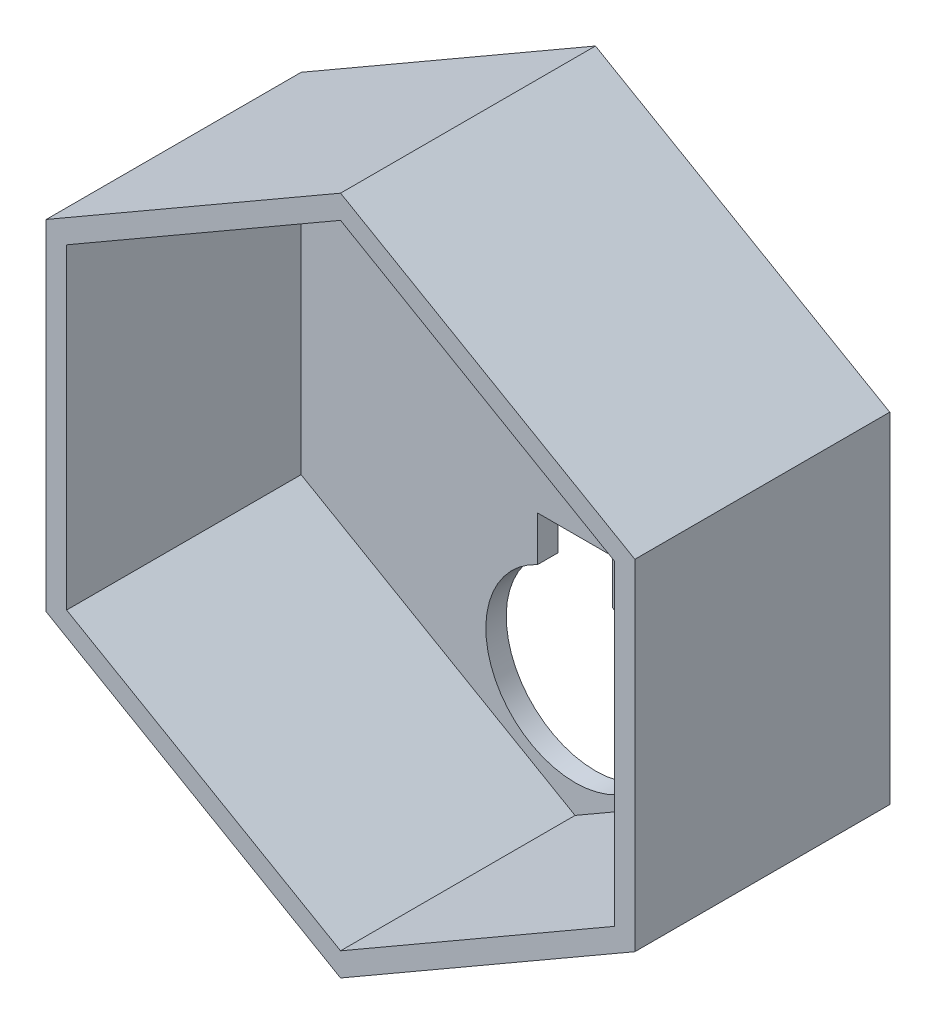
ISO-10303-21;
HEADER;
FILE_DESCRIPTION(('STEP AP214'),'2;1');
FILE_NAME('part.step','',(''),(''),'','','');
FILE_SCHEMA(('AUTOMOTIVE_DESIGN { 1 0 10303 214 1 1 1 1 }'));
ENDSEC;
DATA;
#1=APPLICATION_CONTEXT('core data for automotive mechanical design processes');
#2=APPLICATION_PROTOCOL_DEFINITION('international standard','automotive_design',2000,#1);
#3=PRODUCT_CONTEXT('',#1,'mechanical');
#4=PRODUCT('Part','Part','',(#3));
#5=PRODUCT_RELATED_PRODUCT_CATEGORY('part','',(#4));
#6=PRODUCT_DEFINITION_FORMATION('','',#4);
#7=PRODUCT_DEFINITION_CONTEXT('part definition',#1,'design');
#8=PRODUCT_DEFINITION('design','',#6,#7);
#9=PRODUCT_DEFINITION_SHAPE('','',#8);
#10=(LENGTH_UNIT() NAMED_UNIT(*) SI_UNIT(.MILLI.,.METRE.));
#11=(NAMED_UNIT(*) PLANE_ANGLE_UNIT() SI_UNIT($,.RADIAN.));
#12=(NAMED_UNIT(*) SI_UNIT($,.STERADIAN.) SOLID_ANGLE_UNIT());
#13=UNCERTAINTY_MEASURE_WITH_UNIT(LENGTH_MEASURE(1.E-05),#10,'distance_accuracy_value','');
#14=(GEOMETRIC_REPRESENTATION_CONTEXT(3) GLOBAL_UNCERTAINTY_ASSIGNED_CONTEXT((#13)) GLOBAL_UNIT_ASSIGNED_CONTEXT((#10,
#11,#12)) REPRESENTATION_CONTEXT('',''));
#15=CARTESIAN_POINT('',(0.,0.,0.));
#16=DIRECTION('',(0.,0.,1.));
#17=DIRECTION('',(1.,0.,0.));
#18=AXIS2_PLACEMENT_3D('',#15,#16,#17);
#19=CARTESIAN_POINT('',(0.,0.,15.));
#20=DIRECTION('',(0.,0.,1.));
#21=DIRECTION('',(1.,0.,0.));
#22=AXIS2_PLACEMENT_3D('',#19,#20,#21);
#23=PLANE('',#22);
#24=DIRECTION('',(0.866025403784439,-0.5,0.));
#25=VECTOR('',#24,1.);
#26=CARTESIAN_POINT('',(-17.3205080756888,-9.99999999999999,15.));
#27=LINE('',#26,#25);
#28=CARTESIAN_POINT('',(-17.3205080756888,-9.99999999999999,15.));
#29=VERTEX_POINT('',#28);
#30=CARTESIAN_POINT('',(0.,-20.,15.));
#31=VERTEX_POINT('',#30);
#32=EDGE_CURVE('E259',#29,#31,#27,.T.);
#33=ORIENTED_EDGE('',*,*,#32,.T.);
#34=DIRECTION('',(0.866025403784439,0.5,0.));
#35=VECTOR('',#34,1.);
#36=CARTESIAN_POINT('',(0.,-20.,15.));
#37=LINE('',#36,#35);
#38=CARTESIAN_POINT('',(17.3205080756888,-10.,15.));
#39=VERTEX_POINT('',#38);
#40=EDGE_CURVE('E262',#31,#39,#37,.T.);
#41=ORIENTED_EDGE('',*,*,#40,.T.);
#42=DIRECTION('',(0.,1.,0.));
#43=VECTOR('',#42,1.);
#44=CARTESIAN_POINT('',(17.3205080756888,-10.,15.));
#45=LINE('',#44,#43);
#46=CARTESIAN_POINT('',(17.3205080756888,10.,15.));
#47=VERTEX_POINT('',#46);
#48=EDGE_CURVE('E265',#39,#47,#45,.T.);
#49=ORIENTED_EDGE('',*,*,#48,.T.);
#50=DIRECTION('',(-0.866025403784439,0.5,0.));
#51=VECTOR('',#50,1.);
#52=CARTESIAN_POINT('',(17.3205080756888,10.,15.));
#53=LINE('',#52,#51);
#54=CARTESIAN_POINT('',(0.,20.,15.));
#55=VERTEX_POINT('',#54);
#56=EDGE_CURVE('E267',#47,#55,#53,.T.);
#57=ORIENTED_EDGE('',*,*,#56,.T.);
#58=DIRECTION('',(-0.866025403784439,-0.5,0.));
#59=VECTOR('',#58,1.);
#60=CARTESIAN_POINT('',(0.,20.,15.));
#61=LINE('',#60,#59);
#62=CARTESIAN_POINT('',(-17.3205080756888,10.,15.));
#63=VERTEX_POINT('',#62);
#64=EDGE_CURVE('E269',#55,#63,#61,.T.);
#65=ORIENTED_EDGE('',*,*,#64,.T.);
#66=DIRECTION('',(0.,-1.,0.));
#67=VECTOR('',#66,1.);
#68=CARTESIAN_POINT('',(-17.3205080756888,10.,15.));
#69=LINE('',#68,#67);
#70=EDGE_CURVE('E271',#63,#29,#69,.T.);
#71=ORIENTED_EDGE('',*,*,#70,.T.);
#72=EDGE_LOOP('',(#33,#41,#49,#57,#65,#71));
#73=FACE_BOUND('',#72,.T.);
#74=DIRECTION('',(0.866025403784439,0.5,0.));
#75=VECTOR('',#74,1.);
#76=CARTESIAN_POINT('',(-0.599999999999997,-18.9607695154587,15.));
#77=LINE('',#76,#75);
#78=CARTESIAN_POINT('',(0.,-18.6143593539449,15.));
#79=VERTEX_POINT('',#78);
#80=CARTESIAN_POINT('',(16.1205080756888,-9.30717967697245,15.));
#81=VERTEX_POINT('',#80);
#82=EDGE_CURVE('E232',#79,#81,#77,.T.);
#83=ORIENTED_EDGE('',*,*,#82,.F.);
#84=DIRECTION('',(0.866025403784439,-0.5,0.));
#85=VECTOR('',#84,1.);
#86=CARTESIAN_POINT('',(-16.7205080756888,-8.96076951545867,15.));
#87=LINE('',#86,#85);
#88=CARTESIAN_POINT('',(-16.1205080756888,-9.30717967697244,15.));
#89=VERTEX_POINT('',#88);
#90=EDGE_CURVE('E230',#89,#79,#87,.T.);
#91=ORIENTED_EDGE('',*,*,#90,.F.);
#92=DIRECTION('',(0.,-1.,0.));
#93=VECTOR('',#92,1.);
#94=CARTESIAN_POINT('',(-16.1205080756888,10.,15.));
#95=LINE('',#94,#93);
#96=CARTESIAN_POINT('',(-16.1205080756888,9.30717967697245,15.));
#97=VERTEX_POINT('',#96);
#98=EDGE_CURVE('E241',#97,#89,#95,.T.);
#99=ORIENTED_EDGE('',*,*,#98,.F.);
#100=DIRECTION('',(-0.866025403784439,-0.5,0.));
#101=VECTOR('',#100,1.);
#102=CARTESIAN_POINT('',(0.599999999999993,18.9607695154587,15.));
#103=LINE('',#102,#101);
#104=CARTESIAN_POINT('',(0.,18.6143593539449,15.));
#105=VERTEX_POINT('',#104);
#106=EDGE_CURVE('E238',#105,#97,#103,.T.);
#107=ORIENTED_EDGE('',*,*,#106,.F.);
#108=DIRECTION('',(-0.866025403784439,0.5,0.));
#109=VECTOR('',#108,1.);
#110=CARTESIAN_POINT('',(16.7205080756888,8.96076951545868,15.));
#111=LINE('',#110,#109);
#112=CARTESIAN_POINT('',(16.1205080756888,9.30717967697245,15.));
#113=VERTEX_POINT('',#112);
#114=EDGE_CURVE('E236',#113,#105,#111,.T.);
#115=ORIENTED_EDGE('',*,*,#114,.F.);
#116=DIRECTION('',(0.,1.,0.));
#117=VECTOR('',#116,1.);
#118=CARTESIAN_POINT('',(16.1205080756888,-10.,15.));
#119=LINE('',#118,#117);
#120=EDGE_CURVE('E234',#81,#113,#119,.T.);
#121=ORIENTED_EDGE('',*,*,#120,.F.);
#122=EDGE_LOOP('',(#83,#91,#99,#107,#115,#121));
#123=FACE_BOUND('',#122,.T.);
#124=ADVANCED_FACE('F69',(#73,#123),#23,.T.);
#125=CARTESIAN_POINT('',(0.,0.,0.));
#126=DIRECTION('',(0.,0.,1.));
#127=DIRECTION('',(1.,0.,0.));
#128=AXIS2_PLACEMENT_3D('',#125,#126,#127);
#129=PLANE('',#128);
#130=DIRECTION('',(-1.,0.,0.));
#131=VECTOR('',#130,1.);
#132=CARTESIAN_POINT('',(-2.2,-4.3,0.));
#133=LINE('',#132,#131);
#134=CARTESIAN_POINT('',(2.2,-4.3,0.));
#135=VERTEX_POINT('',#134);
#136=CARTESIAN_POINT('',(-2.2,-4.3,0.));
#137=VERTEX_POINT('',#136);
#138=EDGE_CURVE('E191',#135,#137,#133,.T.);
#139=ORIENTED_EDGE('',*,*,#138,.T.);
#140=DIRECTION('',(0.,-1.,0.));
#141=VECTOR('',#140,1.);
#142=CARTESIAN_POINT('',(-2.2,-4.3,0.));
#143=LINE('',#142,#141);
#144=CARTESIAN_POINT('',(-2.2,-6.92853284530911,0.));
#145=VERTEX_POINT('',#144);
#146=EDGE_CURVE('E204',#137,#145,#143,.T.);
#147=ORIENTED_EDGE('',*,*,#146,.T.);
#148=CARTESIAN_POINT('',(0.,-11.6953451973951,0.));
#149=DIRECTION('',(0.,0.,1.));
#150=DIRECTION('',(1.,0.,0.));
#151=AXIS2_PLACEMENT_3D('',#148,#149,#150);
#152=CIRCLE('',#151,5.25);
#153=CARTESIAN_POINT('',(2.2,-6.92853284530911,0.));
#154=VERTEX_POINT('',#153);
#155=EDGE_CURVE('E203',#145,#154,#152,.T.);
#156=ORIENTED_EDGE('',*,*,#155,.T.);
#157=DIRECTION('',(0.,1.,0.));
#158=VECTOR('',#157,1.);
#159=CARTESIAN_POINT('',(2.2,-4.3,0.));
#160=LINE('',#159,#158);
#161=EDGE_CURVE('E84',#154,#135,#160,.T.);
#162=ORIENTED_EDGE('',*,*,#161,.T.);
#163=EDGE_LOOP('',(#139,#147,#156,#162));
#164=FACE_BOUND('',#163,.T.);
#165=DIRECTION('',(0.866025403784439,-0.5,0.));
#166=VECTOR('',#165,1.);
#167=CARTESIAN_POINT('',(-17.3205080756888,-9.99999999999999,0.));
#168=LINE('',#167,#166);
#169=CARTESIAN_POINT('',(-17.3205080756888,-9.99999999999999,0.));
#170=VERTEX_POINT('',#169);
#171=CARTESIAN_POINT('',(0.,-20.,0.));
#172=VERTEX_POINT('',#171);
#173=EDGE_CURVE('E258',#170,#172,#168,.T.);
#174=ORIENTED_EDGE('',*,*,#173,.F.);
#175=DIRECTION('',(0.,-1.,0.));
#176=VECTOR('',#175,1.);
#177=CARTESIAN_POINT('',(-17.3205080756888,10.,0.));
#178=LINE('',#177,#176);
#179=CARTESIAN_POINT('',(-17.3205080756888,10.,0.));
#180=VERTEX_POINT('',#179);
#181=EDGE_CURVE('E263',#180,#170,#178,.T.);
#182=ORIENTED_EDGE('',*,*,#181,.F.);
#183=DIRECTION('',(-0.866025403784439,-0.5,0.));
#184=VECTOR('',#183,1.);
#185=CARTESIAN_POINT('',(0.,20.,0.));
#186=LINE('',#185,#184);
#187=CARTESIAN_POINT('',(0.,20.,0.));
#188=VERTEX_POINT('',#187);
#189=EDGE_CURVE('E282',#188,#180,#186,.T.);
#190=ORIENTED_EDGE('',*,*,#189,.F.);
#191=DIRECTION('',(-0.866025403784439,0.5,0.));
#192=VECTOR('',#191,1.);
#193=CARTESIAN_POINT('',(17.3205080756888,10.,0.));
#194=LINE('',#193,#192);
#195=CARTESIAN_POINT('',(17.3205080756888,10.,0.));
#196=VERTEX_POINT('',#195);
#197=EDGE_CURVE('E280',#196,#188,#194,.T.);
#198=ORIENTED_EDGE('',*,*,#197,.F.);
#199=DIRECTION('',(0.,1.,0.));
#200=VECTOR('',#199,1.);
#201=CARTESIAN_POINT('',(17.3205080756888,-10.,0.));
#202=LINE('',#201,#200);
#203=CARTESIAN_POINT('',(17.3205080756888,-10.,0.));
#204=VERTEX_POINT('',#203);
#205=EDGE_CURVE('E278',#204,#196,#202,.T.);
#206=ORIENTED_EDGE('',*,*,#205,.F.);
#207=DIRECTION('',(0.866025403784439,0.5,0.));
#208=VECTOR('',#207,1.);
#209=CARTESIAN_POINT('',(0.,-20.,0.));
#210=LINE('',#209,#208);
#211=EDGE_CURVE('E276',#172,#204,#210,.T.);
#212=ORIENTED_EDGE('',*,*,#211,.F.);
#213=EDGE_LOOP('',(#174,#182,#190,#198,#206,#212));
#214=FACE_BOUND('',#213,.T.);
#215=ADVANCED_FACE('F200',(#164,#214),#129,.F.);
#216=CARTESIAN_POINT('',(-17.3205080756888,-9.99999999999999,15.));
#217=DIRECTION('',(0.5,0.866025403784439,0.));
#218=DIRECTION('',(-0.866025403784439,0.5,0.));
#219=AXIS2_PLACEMENT_3D('',#216,#217,#218);
#220=PLANE('',#219);
#221=ORIENTED_EDGE('',*,*,#173,.T.);
#222=DIRECTION('',(0.,0.,-1.));
#223=VECTOR('',#222,1.);
#224=CARTESIAN_POINT('',(0.,-20.,15.));
#225=LINE('',#224,#223);
#226=EDGE_CURVE('E299',#31,#172,#225,.T.);
#227=ORIENTED_EDGE('',*,*,#226,.F.);
#228=ORIENTED_EDGE('',*,*,#32,.F.);
#229=DIRECTION('',(0.,0.,-1.));
#230=VECTOR('',#229,1.);
#231=CARTESIAN_POINT('',(-17.3205080756888,-9.99999999999999,15.));
#232=LINE('',#231,#230);
#233=EDGE_CURVE('E273',#29,#170,#232,.T.);
#234=ORIENTED_EDGE('',*,*,#233,.T.);
#235=EDGE_LOOP('',(#221,#227,#228,#234));
#236=FACE_BOUND('',#235,.T.);
#237=ADVANCED_FACE('F71',(#236),#220,.F.);
#238=CARTESIAN_POINT('',(0.,-20.,15.));
#239=DIRECTION('',(-0.5,0.866025403784439,0.));
#240=DIRECTION('',(-0.866025403784439,-0.5,0.));
#241=AXIS2_PLACEMENT_3D('',#238,#239,#240);
#242=PLANE('',#241);
#243=ORIENTED_EDGE('',*,*,#211,.T.);
#244=DIRECTION('',(0.,0.,-1.));
#245=VECTOR('',#244,1.);
#246=CARTESIAN_POINT('',(17.3205080756888,-10.,15.));
#247=LINE('',#246,#245);
#248=EDGE_CURVE('E296',#39,#204,#247,.T.);
#249=ORIENTED_EDGE('',*,*,#248,.F.);
#250=ORIENTED_EDGE('',*,*,#40,.F.);
#251=ORIENTED_EDGE('',*,*,#226,.T.);
#252=EDGE_LOOP('',(#243,#249,#250,#251));
#253=FACE_BOUND('',#252,.T.);
#254=ADVANCED_FACE('F344',(#253),#242,.F.);
#255=CARTESIAN_POINT('',(17.3205080756888,-10.,15.));
#256=DIRECTION('',(-1.,0.,0.));
#257=DIRECTION('',(0.,0.,1.));
#258=AXIS2_PLACEMENT_3D('',#255,#256,#257);
#259=PLANE('',#258);
#260=ORIENTED_EDGE('',*,*,#205,.T.);
#261=DIRECTION('',(0.,0.,-1.));
#262=VECTOR('',#261,1.);
#263=CARTESIAN_POINT('',(17.3205080756888,10.,15.));
#264=LINE('',#263,#262);
#265=EDGE_CURVE('E293',#47,#196,#264,.T.);
#266=ORIENTED_EDGE('',*,*,#265,.F.);
#267=ORIENTED_EDGE('',*,*,#48,.F.);
#268=ORIENTED_EDGE('',*,*,#248,.T.);
#269=EDGE_LOOP('',(#260,#266,#267,#268));
#270=FACE_BOUND('',#269,.T.);
#271=ADVANCED_FACE('F341',(#270),#259,.F.);
#272=CARTESIAN_POINT('',(17.3205080756888,10.,15.));
#273=DIRECTION('',(-0.5,-0.866025403784439,0.));
#274=DIRECTION('',(0.866025403784439,-0.5,0.));
#275=AXIS2_PLACEMENT_3D('',#272,#273,#274);
#276=PLANE('',#275);
#277=ORIENTED_EDGE('',*,*,#197,.T.);
#278=DIRECTION('',(0.,0.,-1.));
#279=VECTOR('',#278,1.);
#280=CARTESIAN_POINT('',(0.,20.,15.));
#281=LINE('',#280,#279);
#282=EDGE_CURVE('E290',#55,#188,#281,.T.);
#283=ORIENTED_EDGE('',*,*,#282,.F.);
#284=ORIENTED_EDGE('',*,*,#56,.F.);
#285=ORIENTED_EDGE('',*,*,#265,.T.);
#286=EDGE_LOOP('',(#277,#283,#284,#285));
#287=FACE_BOUND('',#286,.T.);
#288=ADVANCED_FACE('F337',(#287),#276,.F.);
#289=CARTESIAN_POINT('',(0.,20.,15.));
#290=DIRECTION('',(0.5,-0.866025403784439,0.));
#291=DIRECTION('',(0.866025403784439,0.5,0.));
#292=AXIS2_PLACEMENT_3D('',#289,#290,#291);
#293=PLANE('',#292);
#294=ORIENTED_EDGE('',*,*,#189,.T.);
#295=DIRECTION('',(0.,0.,-1.));
#296=VECTOR('',#295,1.);
#297=CARTESIAN_POINT('',(-17.3205080756888,10.,15.));
#298=LINE('',#297,#296);
#299=EDGE_CURVE('E287',#63,#180,#298,.T.);
#300=ORIENTED_EDGE('',*,*,#299,.F.);
#301=ORIENTED_EDGE('',*,*,#64,.F.);
#302=ORIENTED_EDGE('',*,*,#282,.T.);
#303=EDGE_LOOP('',(#294,#300,#301,#302));
#304=FACE_BOUND('',#303,.T.);
#305=ADVANCED_FACE('F333',(#304),#293,.F.);
#306=CARTESIAN_POINT('',(-17.3205080756888,10.,15.));
#307=DIRECTION('',(1.,0.,0.));
#308=DIRECTION('',(0.,1.,0.));
#309=AXIS2_PLACEMENT_3D('',#306,#307,#308);
#310=PLANE('',#309);
#311=ORIENTED_EDGE('',*,*,#181,.T.);
#312=ORIENTED_EDGE('',*,*,#233,.F.);
#313=ORIENTED_EDGE('',*,*,#70,.F.);
#314=ORIENTED_EDGE('',*,*,#299,.T.);
#315=EDGE_LOOP('',(#311,#312,#313,#314));
#316=FACE_BOUND('',#315,.T.);
#317=ADVANCED_FACE('F330',(#316),#310,.F.);
#318=CARTESIAN_POINT('',(-16.7205080756888,-8.96076951545867,15.));
#319=DIRECTION('',(0.5,0.866025403784439,0.));
#320=DIRECTION('',(-0.866025403784439,0.5,0.));
#321=AXIS2_PLACEMENT_3D('',#318,#319,#320);
#322=PLANE('',#321);
#323=DIRECTION('',(-0.866025403784439,0.5,0.));
#324=VECTOR('',#323,1.);
#325=CARTESIAN_POINT('',(-16.1205080756888,-9.30717967697244,1.2));
#326=LINE('',#325,#324);
#327=CARTESIAN_POINT('',(0.,-18.6143593539449,1.2));
#328=VERTEX_POINT('',#327);
#329=CARTESIAN_POINT('',(-16.1205080756888,-9.30717967697244,1.2));
#330=VERTEX_POINT('',#329);
#331=EDGE_CURVE('E219',#328,#330,#326,.T.);
#332=ORIENTED_EDGE('',*,*,#331,.T.);
#333=DIRECTION('',(0.,0.,-1.));
#334=VECTOR('',#333,1.);
#335=CARTESIAN_POINT('',(-16.1205080756888,-9.30717967697244,15.));
#336=LINE('',#335,#334);
#337=EDGE_CURVE('E243',#89,#330,#336,.T.);
#338=ORIENTED_EDGE('',*,*,#337,.F.);
#339=ORIENTED_EDGE('',*,*,#90,.T.);
#340=DIRECTION('',(0.,0.,-1.));
#341=VECTOR('',#340,1.);
#342=CARTESIAN_POINT('',(0.,-18.6143593539449,15.));
#343=LINE('',#342,#341);
#344=EDGE_CURVE('E256',#79,#328,#343,.T.);
#345=ORIENTED_EDGE('',*,*,#344,.T.);
#346=EDGE_LOOP('',(#332,#338,#339,#345));
#347=FACE_BOUND('',#346,.T.);
#348=ADVANCED_FACE('F327',(#347),#322,.T.);
#349=CARTESIAN_POINT('',(-0.599999999999997,-18.9607695154587,15.));
#350=DIRECTION('',(-0.5,0.866025403784439,0.));
#351=DIRECTION('',(-0.866025403784439,-0.5,0.));
#352=AXIS2_PLACEMENT_3D('',#349,#350,#351);
#353=PLANE('',#352);
#354=DIRECTION('',(-0.866025403784439,-0.5,0.));
#355=VECTOR('',#354,1.);
#356=CARTESIAN_POINT('',(0.,-18.6143593539449,1.2));
#357=LINE('',#356,#355);
#358=CARTESIAN_POINT('',(16.1205080756888,-9.30717967697245,1.2));
#359=VERTEX_POINT('',#358);
#360=EDGE_CURVE('E92',#359,#328,#357,.T.);
#361=ORIENTED_EDGE('',*,*,#360,.T.);
#362=ORIENTED_EDGE('',*,*,#344,.F.);
#363=ORIENTED_EDGE('',*,*,#82,.T.);
#364=DIRECTION('',(0.,0.,-1.));
#365=VECTOR('',#364,1.);
#366=CARTESIAN_POINT('',(16.1205080756888,-9.30717967697245,15.));
#367=LINE('',#366,#365);
#368=EDGE_CURVE('E254',#81,#359,#367,.T.);
#369=ORIENTED_EDGE('',*,*,#368,.T.);
#370=EDGE_LOOP('',(#361,#362,#363,#369));
#371=FACE_BOUND('',#370,.T.);
#372=ADVANCED_FACE('F440',(#371),#353,.T.);
#373=CARTESIAN_POINT('',(16.1205080756888,-10.,15.));
#374=DIRECTION('',(-1.,0.,0.));
#375=DIRECTION('',(0.,0.,1.));
#376=AXIS2_PLACEMENT_3D('',#373,#374,#375);
#377=PLANE('',#376);
#378=DIRECTION('',(0.,-1.,0.));
#379=VECTOR('',#378,1.);
#380=CARTESIAN_POINT('',(16.1205080756888,-9.30717967697245,1.2));
#381=LINE('',#380,#379);
#382=CARTESIAN_POINT('',(16.1205080756888,9.30717967697245,1.2));
#383=VERTEX_POINT('',#382);
#384=EDGE_CURVE('E228',#383,#359,#381,.T.);
#385=ORIENTED_EDGE('',*,*,#384,.T.);
#386=ORIENTED_EDGE('',*,*,#368,.F.);
#387=ORIENTED_EDGE('',*,*,#120,.T.);
#388=DIRECTION('',(0.,0.,-1.));
#389=VECTOR('',#388,1.);
#390=CARTESIAN_POINT('',(16.1205080756888,9.30717967697245,15.));
#391=LINE('',#390,#389);
#392=EDGE_CURVE('E251',#113,#383,#391,.T.);
#393=ORIENTED_EDGE('',*,*,#392,.T.);
#394=EDGE_LOOP('',(#385,#386,#387,#393));
#395=FACE_BOUND('',#394,.T.);
#396=ADVANCED_FACE('F432',(#395),#377,.T.);
#397=CARTESIAN_POINT('',(16.7205080756888,8.96076951545868,15.));
#398=DIRECTION('',(-0.5,-0.866025403784439,0.));
#399=DIRECTION('',(0.866025403784439,-0.5,0.));
#400=AXIS2_PLACEMENT_3D('',#397,#398,#399);
#401=PLANE('',#400);
#402=DIRECTION('',(0.866025403784439,-0.5,0.));
#403=VECTOR('',#402,1.);
#404=CARTESIAN_POINT('',(16.1205080756888,9.30717967697245,1.2));
#405=LINE('',#404,#403);
#406=CARTESIAN_POINT('',(0.,18.6143593539449,1.2));
#407=VERTEX_POINT('',#406);
#408=EDGE_CURVE('E226',#407,#383,#405,.T.);
#409=ORIENTED_EDGE('',*,*,#408,.T.);
#410=ORIENTED_EDGE('',*,*,#392,.F.);
#411=ORIENTED_EDGE('',*,*,#114,.T.);
#412=DIRECTION('',(0.,0.,-1.));
#413=VECTOR('',#412,1.);
#414=CARTESIAN_POINT('',(0.,18.6143593539449,15.));
#415=LINE('',#414,#413);
#416=EDGE_CURVE('E248',#105,#407,#415,.T.);
#417=ORIENTED_EDGE('',*,*,#416,.T.);
#418=EDGE_LOOP('',(#409,#410,#411,#417));
#419=FACE_BOUND('',#418,.T.);
#420=ADVANCED_FACE('F424',(#419),#401,.T.);
#421=CARTESIAN_POINT('',(0.599999999999993,18.9607695154587,15.));
#422=DIRECTION('',(0.5,-0.866025403784439,0.));
#423=DIRECTION('',(0.866025403784439,0.5,0.));
#424=AXIS2_PLACEMENT_3D('',#421,#422,#423);
#425=PLANE('',#424);
#426=DIRECTION('',(0.866025403784439,0.5,0.));
#427=VECTOR('',#426,1.);
#428=CARTESIAN_POINT('',(0.,18.6143593539449,1.2));
#429=LINE('',#428,#427);
#430=CARTESIAN_POINT('',(-16.1205080756888,9.30717967697245,1.2));
#431=VERTEX_POINT('',#430);
#432=EDGE_CURVE('E224',#431,#407,#429,.T.);
#433=ORIENTED_EDGE('',*,*,#432,.T.);
#434=ORIENTED_EDGE('',*,*,#416,.F.);
#435=ORIENTED_EDGE('',*,*,#106,.T.);
#436=DIRECTION('',(0.,0.,-1.));
#437=VECTOR('',#436,1.);
#438=CARTESIAN_POINT('',(-16.1205080756888,9.30717967697245,15.));
#439=LINE('',#438,#437);
#440=EDGE_CURVE('E245',#97,#431,#439,.T.);
#441=ORIENTED_EDGE('',*,*,#440,.T.);
#442=EDGE_LOOP('',(#433,#434,#435,#441));
#443=FACE_BOUND('',#442,.T.);
#444=ADVANCED_FACE('F419',(#443),#425,.T.);
#445=CARTESIAN_POINT('',(-16.1205080756888,10.,15.));
#446=DIRECTION('',(1.,0.,0.));
#447=DIRECTION('',(0.,1.,0.));
#448=AXIS2_PLACEMENT_3D('',#445,#446,#447);
#449=PLANE('',#448);
#450=DIRECTION('',(0.,1.,0.));
#451=VECTOR('',#450,1.);
#452=CARTESIAN_POINT('',(-16.1205080756888,9.30717967697245,1.2));
#453=LINE('',#452,#451);
#454=EDGE_CURVE('E222',#330,#431,#453,.T.);
#455=ORIENTED_EDGE('',*,*,#454,.T.);
#456=ORIENTED_EDGE('',*,*,#440,.F.);
#457=ORIENTED_EDGE('',*,*,#98,.T.);
#458=ORIENTED_EDGE('',*,*,#337,.T.);
#459=EDGE_LOOP('',(#455,#456,#457,#458));
#460=FACE_BOUND('',#459,.T.);
#461=ADVANCED_FACE('F383',(#460),#449,.T.);
#462=CARTESIAN_POINT('',(0.,0.,1.2));
#463=DIRECTION('',(0.,0.,1.));
#464=DIRECTION('',(1.,0.,0.));
#465=AXIS2_PLACEMENT_3D('',#462,#463,#464);
#466=PLANE('',#465);
#467=DIRECTION('',(0.,-1.,0.));
#468=VECTOR('',#467,1.);
#469=CARTESIAN_POINT('',(-2.2,-4.3,1.2));
#470=LINE('',#469,#468);
#471=CARTESIAN_POINT('',(-2.2,-4.3,1.2));
#472=VERTEX_POINT('',#471);
#473=CARTESIAN_POINT('',(-2.2,-6.92853284530911,1.2));
#474=VERTEX_POINT('',#473);
#475=EDGE_CURVE('E209',#472,#474,#470,.T.);
#476=ORIENTED_EDGE('',*,*,#475,.F.);
#477=DIRECTION('',(-1.,0.,0.));
#478=VECTOR('',#477,1.);
#479=CARTESIAN_POINT('',(-2.2,-4.3,1.2));
#480=LINE('',#479,#478);
#481=CARTESIAN_POINT('',(2.2,-4.3,1.2));
#482=VERTEX_POINT('',#481);
#483=EDGE_CURVE('E206',#482,#472,#480,.T.);
#484=ORIENTED_EDGE('',*,*,#483,.F.);
#485=DIRECTION('',(0.,1.,0.));
#486=VECTOR('',#485,1.);
#487=CARTESIAN_POINT('',(2.2,-4.3,1.2));
#488=LINE('',#487,#486);
#489=CARTESIAN_POINT('',(2.2,-6.92853284530911,1.2));
#490=VERTEX_POINT('',#489);
#491=EDGE_CURVE('E186',#490,#482,#488,.T.);
#492=ORIENTED_EDGE('',*,*,#491,.F.);
#493=CARTESIAN_POINT('',(0.,-11.6953451973951,1.2));
#494=DIRECTION('',(0.,0.,1.));
#495=DIRECTION('',(1.,0.,0.));
#496=AXIS2_PLACEMENT_3D('',#493,#494,#495);
#497=CIRCLE('',#496,5.25);
#498=EDGE_CURVE('E213',#474,#490,#497,.T.);
#499=ORIENTED_EDGE('',*,*,#498,.F.);
#500=EDGE_LOOP('',(#476,#484,#492,#499));
#501=FACE_BOUND('',#500,.T.);
#502=ORIENTED_EDGE('',*,*,#360,.F.);
#503=ORIENTED_EDGE('',*,*,#384,.F.);
#504=ORIENTED_EDGE('',*,*,#408,.F.);
#505=ORIENTED_EDGE('',*,*,#432,.F.);
#506=ORIENTED_EDGE('',*,*,#454,.F.);
#507=ORIENTED_EDGE('',*,*,#331,.F.);
#508=EDGE_LOOP('',(#502,#503,#504,#505,#506,#507));
#509=FACE_BOUND('',#508,.T.);
#510=ADVANCED_FACE('F306',(#501,#509),#466,.T.);
#511=CARTESIAN_POINT('',(0.,-11.6953451973951,0.));
#512=DIRECTION('',(0.,0.,1.));
#513=DIRECTION('',(1.,0.,0.));
#514=AXIS2_PLACEMENT_3D('',#511,#512,#513);
#515=CYLINDRICAL_SURFACE('',#514,5.25);
#516=ORIENTED_EDGE('',*,*,#155,.F.);
#517=DIRECTION('',(0.,0.,1.));
#518=VECTOR('',#517,1.);
#519=CARTESIAN_POINT('',(-2.2,-6.92853284530911,0.));
#520=LINE('',#519,#518);
#521=EDGE_CURVE('E12',#145,#474,#520,.T.);
#522=ORIENTED_EDGE('',*,*,#521,.T.);
#523=ORIENTED_EDGE('',*,*,#498,.T.);
#524=DIRECTION('',(0.,0.,1.));
#525=VECTOR('',#524,1.);
#526=CARTESIAN_POINT('',(2.2,-6.92853284530911,0.));
#527=LINE('',#526,#525);
#528=EDGE_CURVE('E77',#490,#154,#527,.F.);
#529=ORIENTED_EDGE('',*,*,#528,.T.);
#530=EDGE_LOOP('',(#516,#522,#523,#529));
#531=FACE_BOUND('',#530,.T.);
#532=ADVANCED_FACE('F302',(#531),#515,.F.);
#533=CARTESIAN_POINT('',(-2.2,-4.3,0.));
#534=DIRECTION('',(-1.,0.,0.));
#535=DIRECTION('',(0.,-1.,0.));
#536=AXIS2_PLACEMENT_3D('',#533,#534,#535);
#537=PLANE('',#536);
#538=ORIENTED_EDGE('',*,*,#146,.F.);
#539=DIRECTION('',(0.,0.,1.));
#540=VECTOR('',#539,1.);
#541=CARTESIAN_POINT('',(-2.2,-4.3,0.));
#542=LINE('',#541,#540);
#543=EDGE_CURVE('E190',#137,#472,#542,.T.);
#544=ORIENTED_EDGE('',*,*,#543,.T.);
#545=ORIENTED_EDGE('',*,*,#475,.T.);
#546=ORIENTED_EDGE('',*,*,#521,.F.);
#547=EDGE_LOOP('',(#538,#544,#545,#546));
#548=FACE_BOUND('',#547,.T.);
#549=ADVANCED_FACE('F309',(#548),#537,.F.);
#550=CARTESIAN_POINT('',(2.2,-4.3,0.));
#551=DIRECTION('',(1.,0.,0.));
#552=DIRECTION('',(0.,0.,-1.));
#553=AXIS2_PLACEMENT_3D('',#550,#551,#552);
#554=PLANE('',#553);
#555=ORIENTED_EDGE('',*,*,#491,.T.);
#556=DIRECTION('',(0.,0.,1.));
#557=VECTOR('',#556,1.);
#558=CARTESIAN_POINT('',(2.2,-4.3,0.));
#559=LINE('',#558,#557);
#560=EDGE_CURVE('E182',#135,#482,#559,.T.);
#561=ORIENTED_EDGE('',*,*,#560,.F.);
#562=ORIENTED_EDGE('',*,*,#161,.F.);
#563=ORIENTED_EDGE('',*,*,#528,.F.);
#564=EDGE_LOOP('',(#555,#561,#562,#563));
#565=FACE_BOUND('',#564,.T.);
#566=ADVANCED_FACE('F184',(#565),#554,.F.);
#567=CARTESIAN_POINT('',(-2.2,-4.3,0.));
#568=DIRECTION('',(0.,1.,0.));
#569=DIRECTION('',(0.,0.,1.));
#570=AXIS2_PLACEMENT_3D('',#567,#568,#569);
#571=PLANE('',#570);
#572=ORIENTED_EDGE('',*,*,#483,.T.);
#573=ORIENTED_EDGE('',*,*,#543,.F.);
#574=ORIENTED_EDGE('',*,*,#138,.F.);
#575=ORIENTED_EDGE('',*,*,#560,.T.);
#576=EDGE_LOOP('',(#572,#573,#574,#575));
#577=FACE_BOUND('',#576,.T.);
#578=ADVANCED_FACE('F194',(#577),#571,.F.);
#579=CLOSED_SHELL('',(#124,#215,#237,#254,#271,#288,#305,#317,#348,#372,#396,#420,#444,#461,
#510,#532,#549,#566,#578));
#580=MANIFOLD_SOLID_BREP('B2',#579);
#581=ADVANCED_BREP_SHAPE_REPRESENTATION('',(#18,#580),#14);
#582=SHAPE_DEFINITION_REPRESENTATION(#9,#581);
ENDSEC;
END-ISO-10303-21;
